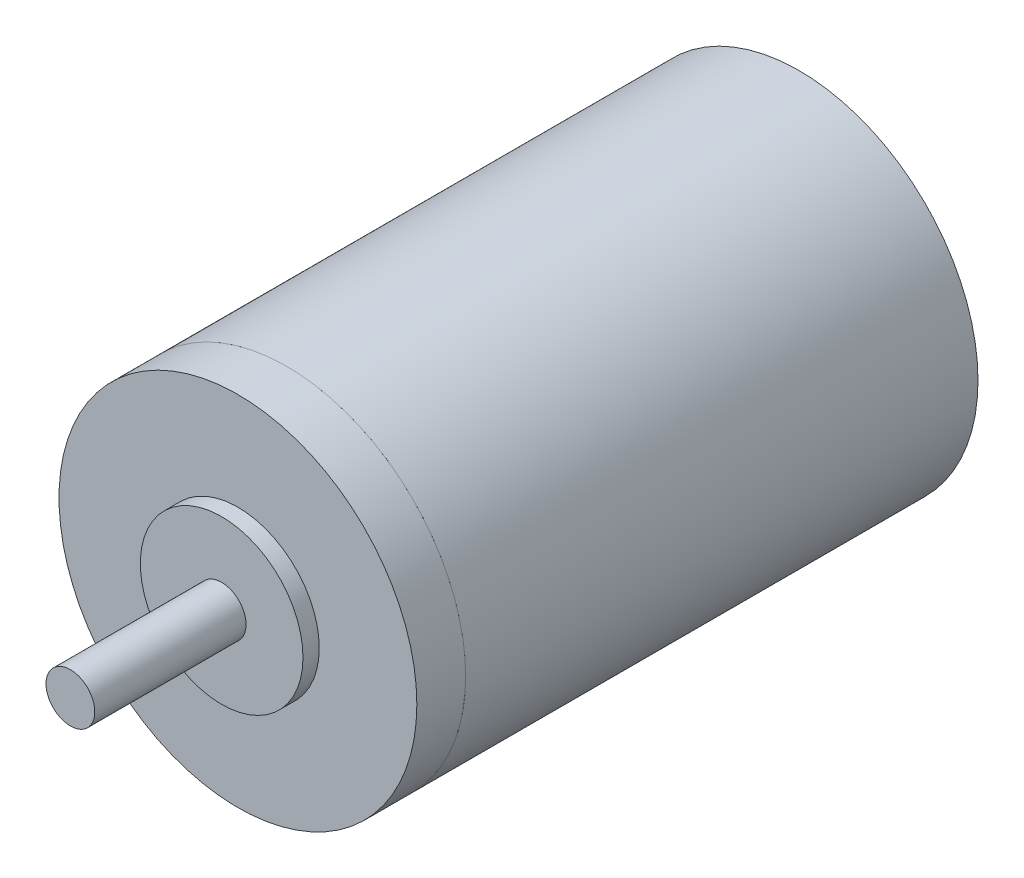
ISO-10303-21;
HEADER;
FILE_DESCRIPTION(('STEP AP214'),'2;1');
FILE_NAME('part.step','',(''),(''),'','','');
FILE_SCHEMA(('AUTOMOTIVE_DESIGN { 1 0 10303 214 1 1 1 1 }'));
ENDSEC;
DATA;
#1=APPLICATION_CONTEXT('core data for automotive mechanical design processes');
#2=APPLICATION_PROTOCOL_DEFINITION('international standard','automotive_design',2000,#1);
#3=PRODUCT_CONTEXT('',#1,'mechanical');
#4=PRODUCT('Part','Part','',(#3));
#5=PRODUCT_RELATED_PRODUCT_CATEGORY('part','',(#4));
#6=PRODUCT_DEFINITION_FORMATION('','',#4);
#7=PRODUCT_DEFINITION_CONTEXT('part definition',#1,'design');
#8=PRODUCT_DEFINITION('design','',#6,#7);
#9=PRODUCT_DEFINITION_SHAPE('','',#8);
#10=(LENGTH_UNIT() NAMED_UNIT(*) SI_UNIT(.MILLI.,.METRE.));
#11=(NAMED_UNIT(*) PLANE_ANGLE_UNIT() SI_UNIT($,.RADIAN.));
#12=(NAMED_UNIT(*) SI_UNIT($,.STERADIAN.) SOLID_ANGLE_UNIT());
#13=UNCERTAINTY_MEASURE_WITH_UNIT(LENGTH_MEASURE(1.E-05),#10,'distance_accuracy_value','');
#14=(GEOMETRIC_REPRESENTATION_CONTEXT(3) GLOBAL_UNCERTAINTY_ASSIGNED_CONTEXT((#13)) GLOBAL_UNIT_ASSIGNED_CONTEXT((#10,
#11,#12)) REPRESENTATION_CONTEXT('',''));
#15=CARTESIAN_POINT('',(0.,0.,0.));
#16=DIRECTION('',(0.,0.,1.));
#17=DIRECTION('',(1.,0.,0.));
#18=AXIS2_PLACEMENT_3D('',#15,#16,#17);
#19=CARTESIAN_POINT('',(0.,-24.3414213562373,1.));
#20=DIRECTION('',(0.,0.,1.));
#21=DIRECTION('',(1.,0.,0.));
#22=AXIS2_PLACEMENT_3D('',#19,#20,#21);
#23=PLANE('',#22);
#24=CARTESIAN_POINT('',(0.,0.,1.));
#25=DIRECTION('',(0.,0.,1.));
#26=DIRECTION('',(1.,0.,0.));
#27=AXIS2_PLACEMENT_3D('',#24,#25,#26);
#28=CIRCLE('',#27,5.);
#29=CARTESIAN_POINT('',(5.,0.,1.));
#30=VERTEX_POINT('',#29);
#31=EDGE_CURVE('E47',#30,#30,#28,.T.);
#32=ORIENTED_EDGE('',*,*,#31,.T.);
#33=EDGE_LOOP('',(#32));
#34=FACE_BOUND('',#33,.T.);
#35=CARTESIAN_POINT('',(0.,0.,1.));
#36=DIRECTION('',(0.,0.,1.));
#37=DIRECTION('',(1.,0.,0.));
#38=AXIS2_PLACEMENT_3D('',#35,#36,#37);
#39=CIRCLE('',#38,1.5);
#40=CARTESIAN_POINT('',(-1.5,0.,0.999999999999999));
#41=VERTEX_POINT('',#40);
#42=EDGE_CURVE('E38',#41,#41,#39,.F.);
#43=ORIENTED_EDGE('',*,*,#42,.T.);
#44=EDGE_LOOP('',(#43));
#45=FACE_BOUND('',#44,.T.);
#46=ADVANCED_FACE('F34',(#34,#45),#23,.T.);
#47=CARTESIAN_POINT('',(0.,-24.3414213562373,0.));
#48=DIRECTION('',(0.,0.,1.));
#49=DIRECTION('',(1.,0.,0.));
#50=AXIS2_PLACEMENT_3D('',#47,#48,#49);
#51=PLANE('',#50);
#52=CARTESIAN_POINT('',(0.,0.,0.));
#53=DIRECTION('',(0.,0.,1.));
#54=DIRECTION('',(1.,0.,0.));
#55=AXIS2_PLACEMENT_3D('',#52,#53,#54);
#56=CIRCLE('',#55,11.);
#57=CARTESIAN_POINT('',(11.,0.,0.));
#58=VERTEX_POINT('',#57);
#59=EDGE_CURVE('E42',#58,#58,#56,.T.);
#60=ORIENTED_EDGE('',*,*,#59,.T.);
#61=EDGE_LOOP('',(#60));
#62=FACE_BOUND('',#61,.T.);
#63=CARTESIAN_POINT('',(0.,0.,0.));
#64=DIRECTION('',(0.,0.,1.));
#65=DIRECTION('',(1.,0.,0.));
#66=AXIS2_PLACEMENT_3D('',#63,#64,#65);
#67=CIRCLE('',#66,5.);
#68=CARTESIAN_POINT('',(5.,0.,0.));
#69=VERTEX_POINT('',#68);
#70=EDGE_CURVE('E49',#69,#69,#67,.T.);
#71=ORIENTED_EDGE('',*,*,#70,.F.);
#72=EDGE_LOOP('',(#71));
#73=FACE_BOUND('',#72,.T.);
#74=ADVANCED_FACE('F91',(#62,#73),#51,.T.);
#75=CARTESIAN_POINT('',(0.,0.,-34.5));
#76=DIRECTION('',(0.,0.,1.));
#77=DIRECTION('',(1.,0.,0.));
#78=AXIS2_PLACEMENT_3D('',#75,#76,#77);
#79=CYLINDRICAL_SURFACE('',#78,11.);
#80=CARTESIAN_POINT('',(0.,0.,-3.));
#81=DIRECTION('',(0.,0.,1.));
#82=DIRECTION('',(1.,0.,0.));
#83=AXIS2_PLACEMENT_3D('',#80,#81,#82);
#84=CIRCLE('',#83,11.);
#85=CARTESIAN_POINT('',(11.,0.,-3.));
#86=VERTEX_POINT('',#85);
#87=EDGE_CURVE('E58',#86,#86,#84,.T.);
#88=ORIENTED_EDGE('',*,*,#87,.T.);
#89=EDGE_LOOP('',(#88));
#90=FACE_BOUND('',#89,.T.);
#91=ORIENTED_EDGE('',*,*,#59,.F.);
#92=EDGE_LOOP('',(#91));
#93=FACE_BOUND('',#92,.T.);
#94=ADVANCED_FACE('F36',(#90,#93),#79,.T.);
#95=CARTESIAN_POINT('',(0.,0.,1.));
#96=DIRECTION('',(0.,0.,-1.));
#97=DIRECTION('',(-1.,0.,0.));
#98=AXIS2_PLACEMENT_3D('',#95,#96,#97);
#99=CYLINDRICAL_SURFACE('',#98,5.);
#100=ORIENTED_EDGE('',*,*,#31,.F.);
#101=EDGE_LOOP('',(#100));
#102=FACE_BOUND('',#101,.T.);
#103=ORIENTED_EDGE('',*,*,#70,.T.);
#104=EDGE_LOOP('',(#103));
#105=FACE_BOUND('',#104,.T.);
#106=ADVANCED_FACE('F90',(#102,#105),#99,.T.);
#107=CARTESIAN_POINT('',(0.,0.,10.3));
#108=DIRECTION('',(0.,0.,-1.));
#109=DIRECTION('',(-1.,0.,0.));
#110=AXIS2_PLACEMENT_3D('',#107,#108,#109);
#111=CYLINDRICAL_SURFACE('',#110,1.5);
#112=CARTESIAN_POINT('',(0.,0.,10.3));
#113=DIRECTION('',(0.,0.,1.));
#114=DIRECTION('',(1.,0.,0.));
#115=AXIS2_PLACEMENT_3D('',#112,#113,#114);
#116=CIRCLE('',#115,1.5);
#117=CARTESIAN_POINT('',(-1.5,0.,10.3));
#118=VERTEX_POINT('',#117);
#119=EDGE_CURVE('E54',#118,#118,#116,.T.);
#120=CARTESIAN_POINT('',(-1.5,0.,0.999999999999999));
#121=CARTESIAN_POINT('',(-1.5,0.,1.096875));
#122=CARTESIAN_POINT('',(-1.5,0.,1.19375));
#123=CARTESIAN_POINT('',(-1.5,0.,1.3875));
#124=CARTESIAN_POINT('',(-1.5,0.,1.484375));
#125=CARTESIAN_POINT('',(-1.5,0.,1.678125));
#126=CARTESIAN_POINT('',(-1.5,0.,1.775));
#127=CARTESIAN_POINT('',(-1.5,0.,1.96875));
#128=CARTESIAN_POINT('',(-1.5,0.,2.065625));
#129=CARTESIAN_POINT('',(-1.5,0.,2.259375));
#130=CARTESIAN_POINT('',(-1.5,0.,2.35625));
#131=CARTESIAN_POINT('',(-1.5,0.,2.55));
#132=CARTESIAN_POINT('',(-1.5,0.,2.646875));
#133=CARTESIAN_POINT('',(-1.5,0.,2.840625));
#134=CARTESIAN_POINT('',(-1.5,0.,2.9375));
#135=CARTESIAN_POINT('',(-1.5,0.,3.13125));
#136=CARTESIAN_POINT('',(-1.5,0.,3.228125));
#137=CARTESIAN_POINT('',(-1.5,0.,3.421875));
#138=CARTESIAN_POINT('',(-1.5,0.,3.51875));
#139=CARTESIAN_POINT('',(-1.5,0.,3.7125));
#140=CARTESIAN_POINT('',(-1.5,0.,3.809375));
#141=CARTESIAN_POINT('',(-1.5,0.,4.003125));
#142=CARTESIAN_POINT('',(-1.5,0.,4.1));
#143=CARTESIAN_POINT('',(-1.5,0.,4.29375));
#144=CARTESIAN_POINT('',(-1.5,0.,4.390625));
#145=CARTESIAN_POINT('',(-1.5,0.,4.584375));
#146=CARTESIAN_POINT('',(-1.5,0.,4.68125));
#147=CARTESIAN_POINT('',(-1.5,0.,4.875));
#148=CARTESIAN_POINT('',(-1.5,0.,4.971875));
#149=CARTESIAN_POINT('',(-1.5,0.,5.165625));
#150=CARTESIAN_POINT('',(-1.5,0.,5.2625));
#151=CARTESIAN_POINT('',(-1.5,0.,5.45625));
#152=CARTESIAN_POINT('',(-1.5,0.,5.553125));
#153=CARTESIAN_POINT('',(-1.5,0.,5.746875));
#154=CARTESIAN_POINT('',(-1.5,0.,5.84375));
#155=CARTESIAN_POINT('',(-1.5,0.,6.0375));
#156=CARTESIAN_POINT('',(-1.5,0.,6.134375));
#157=CARTESIAN_POINT('',(-1.5,0.,6.328125));
#158=CARTESIAN_POINT('',(-1.5,0.,6.425));
#159=CARTESIAN_POINT('',(-1.5,0.,6.61875));
#160=CARTESIAN_POINT('',(-1.5,0.,6.715625));
#161=CARTESIAN_POINT('',(-1.5,0.,6.909375));
#162=CARTESIAN_POINT('',(-1.5,0.,7.00625));
#163=CARTESIAN_POINT('',(-1.5,0.,7.2));
#164=CARTESIAN_POINT('',(-1.5,0.,7.296875));
#165=CARTESIAN_POINT('',(-1.5,0.,7.490625));
#166=CARTESIAN_POINT('',(-1.5,0.,7.5875));
#167=CARTESIAN_POINT('',(-1.5,0.,7.78125));
#168=CARTESIAN_POINT('',(-1.5,0.,7.878125));
#169=CARTESIAN_POINT('',(-1.5,0.,8.071875));
#170=CARTESIAN_POINT('',(-1.5,0.,8.16875));
#171=CARTESIAN_POINT('',(-1.5,0.,8.3625));
#172=CARTESIAN_POINT('',(-1.5,0.,8.459375));
#173=CARTESIAN_POINT('',(-1.5,0.,8.653125));
#174=CARTESIAN_POINT('',(-1.5,0.,8.75));
#175=CARTESIAN_POINT('',(-1.5,0.,8.94375));
#176=CARTESIAN_POINT('',(-1.5,0.,9.040625));
#177=CARTESIAN_POINT('',(-1.5,0.,9.234375));
#178=CARTESIAN_POINT('',(-1.5,0.,9.33125));
#179=CARTESIAN_POINT('',(-1.5,0.,9.525));
#180=CARTESIAN_POINT('',(-1.5,0.,9.621875));
#181=CARTESIAN_POINT('',(-1.5,0.,9.815625));
#182=CARTESIAN_POINT('',(-1.5,0.,9.9125));
#183=CARTESIAN_POINT('',(-1.5,0.,10.10625));
#184=CARTESIAN_POINT('',(-1.5,0.,10.203125));
#185=CARTESIAN_POINT('',(-1.5,0.,10.3));
#186=B_SPLINE_CURVE_WITH_KNOTS('',3,(#120,#121,#122,#123,#124,#125,#126,#127,#128,#129,#130,
#131,#132,#133,#134,#135,#136,#137,#138,#139,#140,#141,#142,#143,#144,#145,#146,#147,#148,#149,
#150,#151,#152,#153,#154,#155,#156,#157,#158,#159,#160,#161,#162,#163,#164,#165,#166,#167,#168,
#169,#170,#171,#172,#173,#174,#175,#176,#177,#178,#179,#180,#181,#182,#183,#184,#185),
.UNSPECIFIED.,.F.,.F.,(4,2,2,2,2,2,2,2,2,2,2,2,2,2,2,2,2,2,2,2,2,2,2,2,2,2,2,2,2,2,2,2,4),(0.,
0.290624999999999,0.58125,0.871874999999999,1.1625,1.453125,1.74375,2.034375,2.325,2.615625,
2.90625,3.196875,3.4875,3.778125,4.06875,4.359375,4.65,4.940625,5.23125,5.521875,5.8125,
6.103125,6.39375,6.684375,6.975,7.265625,7.55625,7.846875,8.1375,8.428125,8.71875,9.009375,9.3),.UNSPECIFIED.);
#187=EDGE_CURVE('BSEAM103',#41,#118,#186,.T.);
#188=ORIENTED_EDGE('',*,*,#42,.F.);
#189=ORIENTED_EDGE('',*,*,#119,.F.);
#190=ORIENTED_EDGE('',*,*,#187,.T.);
#191=ORIENTED_EDGE('',*,*,#187,.F.);
#192=EDGE_LOOP('',(#188,#190,#189,#191));
#193=FACE_BOUND('',#192,.T.);
#194=ADVANCED_FACE('F103',(#193),#111,.T.);
#195=CARTESIAN_POINT('',(0.,0.,10.3));
#196=DIRECTION('',(0.,0.,1.));
#197=DIRECTION('',(1.,0.,0.));
#198=AXIS2_PLACEMENT_3D('',#195,#196,#197);
#199=PLANE('',#198);
#200=ORIENTED_EDGE('',*,*,#119,.T.);
#201=EDGE_LOOP('',(#200));
#202=FACE_BOUND('',#201,.T.);
#203=ADVANCED_FACE('F77',(#202),#199,.T.);
#204=CARTESIAN_POINT('',(0.,0.,-3.001));
#205=DIRECTION('',(0.,0.,1.));
#206=DIRECTION('',(1.,0.,0.));
#207=AXIS2_PLACEMENT_3D('',#204,#205,#206);
#208=PLANE('',#207);
#209=CARTESIAN_POINT('',(0.,0.,-3.001));
#210=DIRECTION('',(0.,0.,1.));
#211=DIRECTION('',(1.,0.,0.));
#212=AXIS2_PLACEMENT_3D('',#209,#210,#211);
#213=CIRCLE('',#212,10.5);
#214=CARTESIAN_POINT('',(10.5,0.,-3.001));
#215=VERTEX_POINT('',#214);
#216=EDGE_CURVE('E61',#215,#215,#213,.T.);
#217=ORIENTED_EDGE('',*,*,#216,.F.);
#218=EDGE_LOOP('',(#217));
#219=FACE_BOUND('',#218,.T.);
#220=CARTESIAN_POINT('',(0.,0.,-3.001));
#221=DIRECTION('',(0.,0.,1.));
#222=DIRECTION('',(1.,0.,0.));
#223=AXIS2_PLACEMENT_3D('',#220,#221,#222);
#224=CIRCLE('',#223,11.);
#225=CARTESIAN_POINT('',(11.,0.,-3.001));
#226=VERTEX_POINT('',#225);
#227=EDGE_CURVE('E57',#226,#226,#224,.T.);
#228=ORIENTED_EDGE('',*,*,#227,.T.);
#229=EDGE_LOOP('',(#228));
#230=FACE_BOUND('',#229,.T.);
#231=ADVANCED_FACE('F73',(#219,#230),#208,.T.);
#232=CARTESIAN_POINT('',(0.,0.,-3.));
#233=DIRECTION('',(0.,0.,1.));
#234=DIRECTION('',(1.,0.,0.));
#235=AXIS2_PLACEMENT_3D('',#232,#233,#234);
#236=PLANE('',#235);
#237=CARTESIAN_POINT('',(0.,0.,-3.));
#238=DIRECTION('',(0.,0.,1.));
#239=DIRECTION('',(1.,0.,0.));
#240=AXIS2_PLACEMENT_3D('',#237,#238,#239);
#241=CIRCLE('',#240,10.5);
#242=CARTESIAN_POINT('',(10.5,0.,-3.));
#243=VERTEX_POINT('',#242);
#244=EDGE_CURVE('E64',#243,#243,#241,.T.);
#245=ORIENTED_EDGE('',*,*,#244,.T.);
#246=EDGE_LOOP('',(#245));
#247=FACE_BOUND('',#246,.T.);
#248=ORIENTED_EDGE('',*,*,#87,.F.);
#249=EDGE_LOOP('',(#248));
#250=FACE_BOUND('',#249,.T.);
#251=ADVANCED_FACE('F76',(#247,#250),#236,.F.);
#252=CARTESIAN_POINT('',(0.,0.,-3.001));
#253=DIRECTION('',(0.,0.,1.));
#254=DIRECTION('',(1.,0.,0.));
#255=AXIS2_PLACEMENT_3D('',#252,#253,#254);
#256=CYLINDRICAL_SURFACE('',#255,10.5);
#257=ORIENTED_EDGE('',*,*,#216,.T.);
#258=EDGE_LOOP('',(#257));
#259=FACE_BOUND('',#258,.T.);
#260=ORIENTED_EDGE('',*,*,#244,.F.);
#261=EDGE_LOOP('',(#260));
#262=FACE_BOUND('',#261,.T.);
#263=ADVANCED_FACE('F70',(#259,#262),#256,.T.);
#264=CARTESIAN_POINT('',(0.,-24.3414213562373,-34.5));
#265=DIRECTION('',(0.,0.,1.));
#266=DIRECTION('',(1.,0.,0.));
#267=AXIS2_PLACEMENT_3D('',#264,#265,#266);
#268=PLANE('',#267);
#269=CARTESIAN_POINT('',(0.,0.,-34.5));
#270=DIRECTION('',(0.,0.,1.));
#271=DIRECTION('',(1.,0.,0.));
#272=AXIS2_PLACEMENT_3D('',#269,#270,#271);
#273=CIRCLE('',#272,11.);
#274=CARTESIAN_POINT('',(11.,0.,-34.5));
#275=VERTEX_POINT('',#274);
#276=EDGE_CURVE('E10',#275,#275,#273,.T.);
#277=ORIENTED_EDGE('',*,*,#276,.F.);
#278=EDGE_LOOP('',(#277));
#279=FACE_BOUND('',#278,.T.);
#280=ADVANCED_FACE('F83',(#279),#268,.F.);
#281=ORIENTED_EDGE('',*,*,#276,.T.);
#282=EDGE_LOOP('',(#281));
#283=FACE_BOUND('',#282,.T.);
#284=ORIENTED_EDGE('',*,*,#227,.F.);
#285=EDGE_LOOP('',(#284));
#286=FACE_BOUND('',#285,.T.);
#287=ADVANCED_FACE('F81',(#283,#286),#79,.T.);
#288=CLOSED_SHELL('',(#46,#74,#94,#106,#194,#203,#231,#251,#263,#280,#287));
#289=MANIFOLD_SOLID_BREP('B2',#288);
#290=ADVANCED_BREP_SHAPE_REPRESENTATION('',(#18,#289),#14);
#291=SHAPE_DEFINITION_REPRESENTATION(#9,#290);
ENDSEC;
END-ISO-10303-21;
